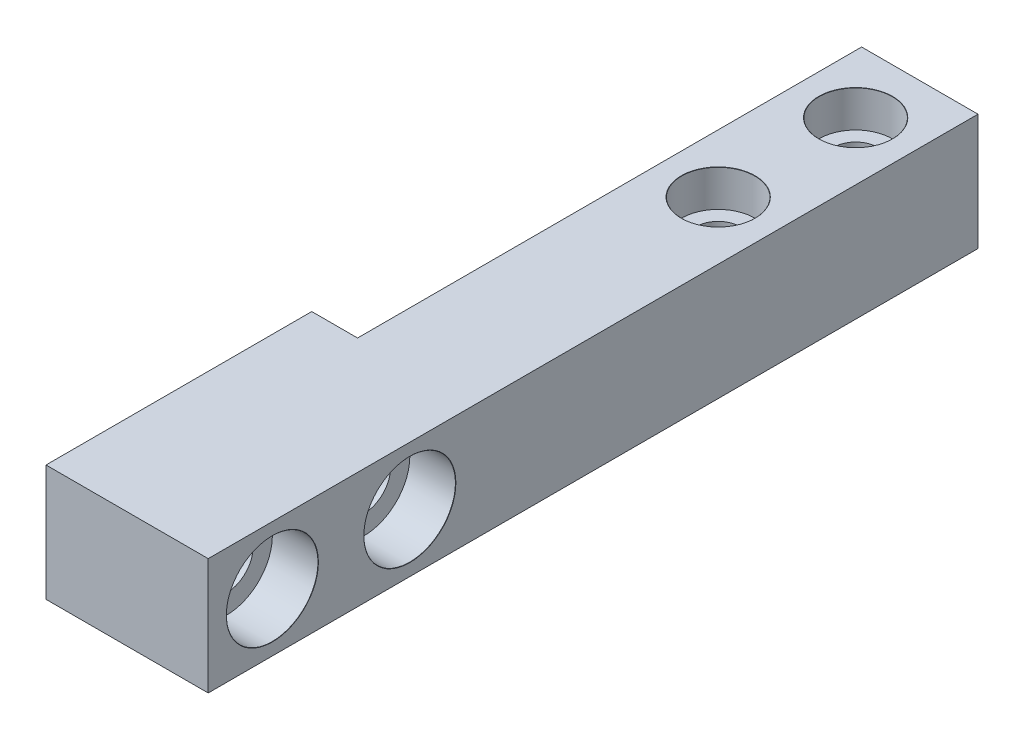
ISO-10303-21;
HEADER;
FILE_DESCRIPTION(('STEP AP214'),'2;1');
FILE_NAME('part.step','',(''),(''),'','','');
FILE_SCHEMA(('AUTOMOTIVE_DESIGN { 1 0 10303 214 1 1 1 1 }'));
ENDSEC;
DATA;
#1=APPLICATION_CONTEXT('core data for automotive mechanical design processes');
#2=APPLICATION_PROTOCOL_DEFINITION('international standard','automotive_design',2000,#1);
#3=PRODUCT_CONTEXT('',#1,'mechanical');
#4=PRODUCT('Part','Part','',(#3));
#5=PRODUCT_RELATED_PRODUCT_CATEGORY('part','',(#4));
#6=PRODUCT_DEFINITION_FORMATION('','',#4);
#7=PRODUCT_DEFINITION_CONTEXT('part definition',#1,'design');
#8=PRODUCT_DEFINITION('design','',#6,#7);
#9=PRODUCT_DEFINITION_SHAPE('','',#8);
#10=(LENGTH_UNIT() NAMED_UNIT(*) SI_UNIT(.MILLI.,.METRE.));
#11=(NAMED_UNIT(*) PLANE_ANGLE_UNIT() SI_UNIT($,.RADIAN.));
#12=(NAMED_UNIT(*) SI_UNIT($,.STERADIAN.) SOLID_ANGLE_UNIT());
#13=UNCERTAINTY_MEASURE_WITH_UNIT(LENGTH_MEASURE(1.E-05),#10,'distance_accuracy_value','');
#14=(GEOMETRIC_REPRESENTATION_CONTEXT(3) GLOBAL_UNCERTAINTY_ASSIGNED_CONTEXT((#13)) GLOBAL_UNIT_ASSIGNED_CONTEXT((#10,
#11,#12)) REPRESENTATION_CONTEXT('',''));
#15=CARTESIAN_POINT('',(0.,0.,0.));
#16=DIRECTION('',(0.,0.,1.));
#17=DIRECTION('',(1.,0.,0.));
#18=AXIS2_PLACEMENT_3D('',#15,#16,#17);
#19=CARTESIAN_POINT('',(-6.35,12.7,42.));
#20=DIRECTION('',(1.,0.,0.));
#21=DIRECTION('',(0.,0.,-1.));
#22=AXIS2_PLACEMENT_3D('',#19,#20,#21);
#23=PLANE('',#22);
#24=DIRECTION('',(0.,-1.,0.));
#25=VECTOR('',#24,1.);
#26=CARTESIAN_POINT('',(-6.35,12.7,13.));
#27=LINE('',#26,#25);
#28=CARTESIAN_POINT('',(-6.35,12.7,13.));
#29=VERTEX_POINT('',#28);
#30=CARTESIAN_POINT('',(-6.35,0.,13.));
#31=VERTEX_POINT('',#30);
#32=EDGE_CURVE('E53',#29,#31,#27,.T.);
#33=ORIENTED_EDGE('',*,*,#32,.F.);
#34=DIRECTION('',(0.,0.,1.));
#35=VECTOR('',#34,1.);
#36=CARTESIAN_POINT('',(-6.35,12.7,42.));
#37=LINE('',#36,#35);
#38=CARTESIAN_POINT('',(-6.35,12.7,-42.));
#39=VERTEX_POINT('',#38);
#40=EDGE_CURVE('E102',#39,#29,#37,.T.);
#41=ORIENTED_EDGE('',*,*,#40,.F.);
#42=DIRECTION('',(0.,-1.,0.));
#43=VECTOR('',#42,1.);
#44=CARTESIAN_POINT('',(-6.35,12.7,-42.));
#45=LINE('',#44,#43);
#46=CARTESIAN_POINT('',(-6.35,0.,-42.));
#47=VERTEX_POINT('',#46);
#48=EDGE_CURVE('E46',#39,#47,#45,.T.);
#49=ORIENTED_EDGE('',*,*,#48,.T.);
#50=DIRECTION('',(0.,0.,1.));
#51=VECTOR('',#50,1.);
#52=CARTESIAN_POINT('',(-6.35,0.,42.));
#53=LINE('',#52,#51);
#54=EDGE_CURVE('E168',#47,#31,#53,.T.);
#55=ORIENTED_EDGE('',*,*,#54,.T.);
#56=EDGE_LOOP('',(#33,#41,#49,#55));
#57=FACE_BOUND('',#56,.T.);
#58=ADVANCED_FACE('F38',(#57),#23,.F.);
#59=CARTESIAN_POINT('',(6.35,12.7,42.));
#60=DIRECTION('',(-1.,0.,0.));
#61=DIRECTION('',(0.,0.,1.));
#62=AXIS2_PLACEMENT_3D('',#59,#60,#61);
#63=PLANE('',#62);
#64=CARTESIAN_POINT('',(6.35,6.35,35.));
#65=DIRECTION('',(1.,0.,0.));
#66=DIRECTION('',(0.,0.,-1.));
#67=AXIS2_PLACEMENT_3D('',#64,#65,#66);
#68=CIRCLE('',#67,5.025);
#69=CARTESIAN_POINT('',(6.35,6.35,29.975));
#70=VERTEX_POINT('',#69);
#71=EDGE_CURVE('E383',#70,#70,#68,.T.);
#72=ORIENTED_EDGE('',*,*,#71,.F.);
#73=EDGE_LOOP('',(#72));
#74=FACE_BOUND('',#73,.T.);
#75=CARTESIAN_POINT('',(6.35,6.35,20.));
#76=DIRECTION('',(1.,0.,0.));
#77=DIRECTION('',(0.,0.,-1.));
#78=AXIS2_PLACEMENT_3D('',#75,#76,#77);
#79=CIRCLE('',#78,5.025);
#80=CARTESIAN_POINT('',(6.35,6.35,14.975));
#81=VERTEX_POINT('',#80);
#82=EDGE_CURVE('E396',#81,#81,#79,.T.);
#83=ORIENTED_EDGE('',*,*,#82,.F.);
#84=EDGE_LOOP('',(#83));
#85=FACE_BOUND('',#84,.T.);
#86=DIRECTION('',(0.,0.,-1.));
#87=VECTOR('',#86,1.);
#88=CARTESIAN_POINT('',(6.35,0.,42.));
#89=LINE('',#88,#87);
#90=CARTESIAN_POINT('',(6.35,0.,42.));
#91=VERTEX_POINT('',#90);
#92=CARTESIAN_POINT('',(6.35,0.,-42.));
#93=VERTEX_POINT('',#92);
#94=EDGE_CURVE('E159',#91,#93,#89,.T.);
#95=ORIENTED_EDGE('',*,*,#94,.T.);
#96=DIRECTION('',(0.,-1.,0.));
#97=VECTOR('',#96,1.);
#98=CARTESIAN_POINT('',(6.35,12.7,-42.));
#99=LINE('',#98,#97);
#100=CARTESIAN_POINT('',(6.35,12.7,-42.));
#101=VERTEX_POINT('',#100);
#102=EDGE_CURVE('E11',#101,#93,#99,.T.);
#103=ORIENTED_EDGE('',*,*,#102,.F.);
#104=DIRECTION('',(0.,0.,-1.));
#105=VECTOR('',#104,1.);
#106=CARTESIAN_POINT('',(6.35,12.7,42.));
#107=LINE('',#106,#105);
#108=CARTESIAN_POINT('',(6.35,12.7,42.));
#109=VERTEX_POINT('',#108);
#110=EDGE_CURVE('E160',#109,#101,#107,.T.);
#111=ORIENTED_EDGE('',*,*,#110,.F.);
#112=DIRECTION('',(0.,-1.,0.));
#113=VECTOR('',#112,1.);
#114=CARTESIAN_POINT('',(6.35,12.7,42.));
#115=LINE('',#114,#113);
#116=EDGE_CURVE('E100',#109,#91,#115,.T.);
#117=ORIENTED_EDGE('',*,*,#116,.T.);
#118=EDGE_LOOP('',(#95,#103,#111,#117));
#119=FACE_BOUND('',#118,.T.);
#120=ADVANCED_FACE('F40',(#74,#85,#119),#63,.F.);
#121=CARTESIAN_POINT('',(-6.35,12.7,-42.));
#122=DIRECTION('',(0.,0.,1.));
#123=DIRECTION('',(1.,0.,0.));
#124=AXIS2_PLACEMENT_3D('',#121,#122,#123);
#125=PLANE('',#124);
#126=DIRECTION('',(-1.,0.,0.));
#127=VECTOR('',#126,1.);
#128=CARTESIAN_POINT('',(-6.35,0.,-42.));
#129=LINE('',#128,#127);
#130=EDGE_CURVE('E166',#93,#47,#129,.T.);
#131=ORIENTED_EDGE('',*,*,#130,.T.);
#132=ORIENTED_EDGE('',*,*,#48,.F.);
#133=DIRECTION('',(-1.,0.,0.));
#134=VECTOR('',#133,1.);
#135=CARTESIAN_POINT('',(-6.35,12.7,-42.));
#136=LINE('',#135,#134);
#137=EDGE_CURVE('E85',#101,#39,#136,.T.);
#138=ORIENTED_EDGE('',*,*,#137,.F.);
#139=ORIENTED_EDGE('',*,*,#102,.T.);
#140=EDGE_LOOP('',(#131,#132,#138,#139));
#141=FACE_BOUND('',#140,.T.);
#142=ADVANCED_FACE('F199',(#141),#125,.F.);
#143=CARTESIAN_POINT('',(-6.35,12.7,42.));
#144=DIRECTION('',(0.,0.,-1.));
#145=DIRECTION('',(-1.,0.,0.));
#146=AXIS2_PLACEMENT_3D('',#143,#144,#145);
#147=PLANE('',#146);
#148=DIRECTION('',(1.,0.,0.));
#149=VECTOR('',#148,1.);
#150=CARTESIAN_POINT('',(-6.35,0.,42.));
#151=LINE('',#150,#149);
#152=CARTESIAN_POINT('',(-11.35,0.,42.));
#153=VERTEX_POINT('',#152);
#154=EDGE_CURVE('E80',#153,#91,#151,.T.);
#155=ORIENTED_EDGE('',*,*,#154,.T.);
#156=ORIENTED_EDGE('',*,*,#116,.F.);
#157=DIRECTION('',(1.,0.,0.));
#158=VECTOR('',#157,1.);
#159=CARTESIAN_POINT('',(-6.35,12.7,42.));
#160=LINE('',#159,#158);
#161=CARTESIAN_POINT('',(-11.35,12.7,42.));
#162=VERTEX_POINT('',#161);
#163=EDGE_CURVE('E62',#162,#109,#160,.T.);
#164=ORIENTED_EDGE('',*,*,#163,.F.);
#165=DIRECTION('',(0.,1.,0.));
#166=VECTOR('',#165,1.);
#167=CARTESIAN_POINT('',(-11.35,12.7,42.));
#168=LINE('',#167,#166);
#169=EDGE_CURVE('E99',#153,#162,#168,.T.);
#170=ORIENTED_EDGE('',*,*,#169,.F.);
#171=EDGE_LOOP('',(#155,#156,#164,#170));
#172=FACE_BOUND('',#171,.T.);
#173=ADVANCED_FACE('F97',(#172),#147,.F.);
#174=CARTESIAN_POINT('',(0.,12.7,0.));
#175=DIRECTION('',(0.,-1.,0.));
#176=DIRECTION('',(0.,0.,-1.));
#177=AXIS2_PLACEMENT_3D('',#174,#175,#176);
#178=PLANE('',#177);
#179=CARTESIAN_POINT('',(0.,12.7,-35.));
#180=DIRECTION('',(0.,1.,0.));
#181=DIRECTION('',(0.,0.,1.));
#182=AXIS2_PLACEMENT_3D('',#179,#180,#181);
#183=CIRCLE('',#182,4.025);
#184=CARTESIAN_POINT('',(0.,12.7,-30.975));
#185=VERTEX_POINT('',#184);
#186=EDGE_CURVE('E129',#185,#185,#183,.T.);
#187=ORIENTED_EDGE('',*,*,#186,.F.);
#188=EDGE_LOOP('',(#187));
#189=FACE_BOUND('',#188,.T.);
#190=CARTESIAN_POINT('',(0.,12.7,-20.));
#191=DIRECTION('',(0.,1.,0.));
#192=DIRECTION('',(0.,0.,1.));
#193=AXIS2_PLACEMENT_3D('',#190,#191,#192);
#194=CIRCLE('',#193,4.025);
#195=CARTESIAN_POINT('',(0.,12.7,-15.975));
#196=VERTEX_POINT('',#195);
#197=EDGE_CURVE('E144',#196,#196,#194,.T.);
#198=ORIENTED_EDGE('',*,*,#197,.F.);
#199=EDGE_LOOP('',(#198));
#200=FACE_BOUND('',#199,.T.);
#201=ORIENTED_EDGE('',*,*,#110,.T.);
#202=ORIENTED_EDGE('',*,*,#137,.T.);
#203=ORIENTED_EDGE('',*,*,#40,.T.);
#204=DIRECTION('',(1.,0.,0.));
#205=VECTOR('',#204,1.);
#206=CARTESIAN_POINT('',(-11.35,12.7,13.));
#207=LINE('',#206,#205);
#208=CARTESIAN_POINT('',(-11.35,12.7,13.));
#209=VERTEX_POINT('',#208);
#210=EDGE_CURVE('E108',#209,#29,#207,.T.);
#211=ORIENTED_EDGE('',*,*,#210,.F.);
#212=DIRECTION('',(0.,0.,-1.));
#213=VECTOR('',#212,1.);
#214=CARTESIAN_POINT('',(-11.35,12.7,42.));
#215=LINE('',#214,#213);
#216=EDGE_CURVE('E105',#162,#209,#215,.T.);
#217=ORIENTED_EDGE('',*,*,#216,.F.);
#218=ORIENTED_EDGE('',*,*,#163,.T.);
#219=EDGE_LOOP('',(#201,#202,#203,#211,#217,#218));
#220=FACE_BOUND('',#219,.T.);
#221=ADVANCED_FACE('F106',(#189,#200,#220),#178,.F.);
#222=CARTESIAN_POINT('',(0.,0.,0.));
#223=DIRECTION('',(0.,-1.,0.));
#224=DIRECTION('',(0.,0.,-1.));
#225=AXIS2_PLACEMENT_3D('',#222,#223,#224);
#226=PLANE('',#225);
#227=CARTESIAN_POINT('',(0.,0.,-35.));
#228=DIRECTION('',(0.,1.,0.));
#229=DIRECTION('',(0.,0.,1.));
#230=AXIS2_PLACEMENT_3D('',#227,#228,#229);
#231=CIRCLE('',#230,2.4);
#232=CARTESIAN_POINT('',(0.,0.,-32.6));
#233=VERTEX_POINT('',#232);
#234=EDGE_CURVE('E141',#233,#233,#231,.T.);
#235=ORIENTED_EDGE('',*,*,#234,.T.);
#236=EDGE_LOOP('',(#235));
#237=FACE_BOUND('',#236,.T.);
#238=CARTESIAN_POINT('',(0.,0.,-20.));
#239=DIRECTION('',(0.,1.,0.));
#240=DIRECTION('',(0.,0.,1.));
#241=AXIS2_PLACEMENT_3D('',#238,#239,#240);
#242=CIRCLE('',#241,2.4);
#243=CARTESIAN_POINT('',(0.,0.,-17.6));
#244=VERTEX_POINT('',#243);
#245=EDGE_CURVE('E156',#244,#244,#242,.T.);
#246=ORIENTED_EDGE('',*,*,#245,.T.);
#247=EDGE_LOOP('',(#246));
#248=FACE_BOUND('',#247,.T.);
#249=ORIENTED_EDGE('',*,*,#94,.F.);
#250=ORIENTED_EDGE('',*,*,#154,.F.);
#251=DIRECTION('',(0.,0.,1.));
#252=VECTOR('',#251,1.);
#253=CARTESIAN_POINT('',(-11.35,0.,42.));
#254=LINE('',#253,#252);
#255=CARTESIAN_POINT('',(-11.35,0.,13.));
#256=VERTEX_POINT('',#255);
#257=EDGE_CURVE('E116',#256,#153,#254,.T.);
#258=ORIENTED_EDGE('',*,*,#257,.F.);
#259=DIRECTION('',(1.,0.,0.));
#260=VECTOR('',#259,1.);
#261=CARTESIAN_POINT('',(-11.35,0.,13.));
#262=LINE('',#261,#260);
#263=EDGE_CURVE('E124',#256,#31,#262,.T.);
#264=ORIENTED_EDGE('',*,*,#263,.T.);
#265=ORIENTED_EDGE('',*,*,#54,.F.);
#266=ORIENTED_EDGE('',*,*,#130,.F.);
#267=EDGE_LOOP('',(#249,#250,#258,#264,#265,#266));
#268=FACE_BOUND('',#267,.T.);
#269=ADVANCED_FACE('F175',(#237,#248,#268),#226,.T.);
#270=CARTESIAN_POINT('',(0.,12.7,-20.));
#271=DIRECTION('',(0.,1.,0.));
#272=DIRECTION('',(0.,0.,1.));
#273=AXIS2_PLACEMENT_3D('',#270,#271,#272);
#274=CYLINDRICAL_SURFACE('',#273,2.4);
#275=ORIENTED_EDGE('',*,*,#245,.F.);
#276=EDGE_LOOP('',(#275));
#277=FACE_BOUND('',#276,.T.);
#278=CARTESIAN_POINT('',(0.,8.7,-20.));
#279=DIRECTION('',(0.,1.,0.));
#280=DIRECTION('',(0.,0.,1.));
#281=AXIS2_PLACEMENT_3D('',#278,#279,#280);
#282=CIRCLE('',#281,2.4);
#283=CARTESIAN_POINT('',(0.,8.7,-17.6));
#284=VERTEX_POINT('',#283);
#285=EDGE_CURVE('E153',#284,#284,#282,.T.);
#286=ORIENTED_EDGE('',*,*,#285,.T.);
#287=EDGE_LOOP('',(#286));
#288=FACE_BOUND('',#287,.T.);
#289=ADVANCED_FACE('F216',(#277,#288),#274,.F.);
#290=CARTESIAN_POINT('',(4.,8.7,-20.));
#291=DIRECTION('',(0.,-1.,0.));
#292=DIRECTION('',(0.,0.,-1.));
#293=AXIS2_PLACEMENT_3D('',#290,#291,#292);
#294=PLANE('',#293);
#295=ORIENTED_EDGE('',*,*,#285,.F.);
#296=EDGE_LOOP('',(#295));
#297=FACE_BOUND('',#296,.T.);
#298=CARTESIAN_POINT('',(0.,8.7,-20.));
#299=DIRECTION('',(0.,1.,0.));
#300=DIRECTION('',(0.,0.,1.));
#301=AXIS2_PLACEMENT_3D('',#298,#299,#300);
#302=CIRCLE('',#301,4.);
#303=CARTESIAN_POINT('',(0.,8.7,-16.));
#304=VERTEX_POINT('',#303);
#305=EDGE_CURVE('E150',#304,#304,#302,.T.);
#306=ORIENTED_EDGE('',*,*,#305,.T.);
#307=EDGE_LOOP('',(#306));
#308=FACE_BOUND('',#307,.T.);
#309=ADVANCED_FACE('F222',(#297,#308),#294,.F.);
#310=CARTESIAN_POINT('',(0.,12.7,-20.));
#311=DIRECTION('',(0.,1.,0.));
#312=DIRECTION('',(0.,0.,1.));
#313=AXIS2_PLACEMENT_3D('',#310,#311,#312);
#314=CYLINDRICAL_SURFACE('',#313,4.);
#315=ORIENTED_EDGE('',*,*,#305,.F.);
#316=EDGE_LOOP('',(#315));
#317=FACE_BOUND('',#316,.T.);
#318=CARTESIAN_POINT('',(0.,12.6790225092206,-20.));
#319=DIRECTION('',(0.,1.,0.));
#320=DIRECTION('',(0.,0.,1.));
#321=AXIS2_PLACEMENT_3D('',#318,#319,#320);
#322=CIRCLE('',#321,4.);
#323=CARTESIAN_POINT('',(0.,12.6790225092206,-16.));
#324=VERTEX_POINT('',#323);
#325=EDGE_CURVE('E147',#324,#324,#322,.T.);
#326=ORIENTED_EDGE('',*,*,#325,.T.);
#327=EDGE_LOOP('',(#326));
#328=FACE_BOUND('',#327,.T.);
#329=ADVANCED_FACE('F226',(#317,#328),#314,.F.);
#330=CARTESIAN_POINT('',(0.,12.7,-20.));
#331=DIRECTION('',(0.,1.,0.));
#332=DIRECTION('',(0.,0.,1.));
#333=AXIS2_PLACEMENT_3D('',#330,#331,#332);
#334=CONICAL_SURFACE('',#333,4.025,0.872664625997152);
#335=ORIENTED_EDGE('',*,*,#325,.F.);
#336=EDGE_LOOP('',(#335));
#337=FACE_BOUND('',#336,.T.);
#338=ORIENTED_EDGE('',*,*,#197,.T.);
#339=EDGE_LOOP('',(#338));
#340=FACE_BOUND('',#339,.T.);
#341=ADVANCED_FACE('F230',(#337,#340),#334,.F.);
#342=CARTESIAN_POINT('',(0.,12.7,-35.));
#343=DIRECTION('',(0.,1.,0.));
#344=DIRECTION('',(0.,0.,1.));
#345=AXIS2_PLACEMENT_3D('',#342,#343,#344);
#346=CYLINDRICAL_SURFACE('',#345,2.4);
#347=ORIENTED_EDGE('',*,*,#234,.F.);
#348=EDGE_LOOP('',(#347));
#349=FACE_BOUND('',#348,.T.);
#350=CARTESIAN_POINT('',(0.,8.7,-35.));
#351=DIRECTION('',(0.,1.,0.));
#352=DIRECTION('',(0.,0.,1.));
#353=AXIS2_PLACEMENT_3D('',#350,#351,#352);
#354=CIRCLE('',#353,2.4);
#355=CARTESIAN_POINT('',(0.,8.7,-32.6));
#356=VERTEX_POINT('',#355);
#357=EDGE_CURVE('E138',#356,#356,#354,.T.);
#358=ORIENTED_EDGE('',*,*,#357,.T.);
#359=EDGE_LOOP('',(#358));
#360=FACE_BOUND('',#359,.T.);
#361=ADVANCED_FACE('F234',(#349,#360),#346,.F.);
#362=CARTESIAN_POINT('',(4.,8.7,-35.));
#363=DIRECTION('',(0.,-1.,0.));
#364=DIRECTION('',(0.,0.,-1.));
#365=AXIS2_PLACEMENT_3D('',#362,#363,#364);
#366=PLANE('',#365);
#367=ORIENTED_EDGE('',*,*,#357,.F.);
#368=EDGE_LOOP('',(#367));
#369=FACE_BOUND('',#368,.T.);
#370=CARTESIAN_POINT('',(0.,8.7,-35.));
#371=DIRECTION('',(0.,1.,0.));
#372=DIRECTION('',(0.,0.,1.));
#373=AXIS2_PLACEMENT_3D('',#370,#371,#372);
#374=CIRCLE('',#373,4.);
#375=CARTESIAN_POINT('',(0.,8.7,-31.));
#376=VERTEX_POINT('',#375);
#377=EDGE_CURVE('E135',#376,#376,#374,.T.);
#378=ORIENTED_EDGE('',*,*,#377,.T.);
#379=EDGE_LOOP('',(#378));
#380=FACE_BOUND('',#379,.T.);
#381=ADVANCED_FACE('F238',(#369,#380),#366,.F.);
#382=CARTESIAN_POINT('',(0.,12.7,-35.));
#383=DIRECTION('',(0.,1.,0.));
#384=DIRECTION('',(0.,0.,1.));
#385=AXIS2_PLACEMENT_3D('',#382,#383,#384);
#386=CYLINDRICAL_SURFACE('',#385,4.);
#387=ORIENTED_EDGE('',*,*,#377,.F.);
#388=EDGE_LOOP('',(#387));
#389=FACE_BOUND('',#388,.T.);
#390=CARTESIAN_POINT('',(0.,12.6790225092206,-35.));
#391=DIRECTION('',(0.,1.,0.));
#392=DIRECTION('',(0.,0.,1.));
#393=AXIS2_PLACEMENT_3D('',#390,#391,#392);
#394=CIRCLE('',#393,4.);
#395=CARTESIAN_POINT('',(0.,12.6790225092206,-31.));
#396=VERTEX_POINT('',#395);
#397=EDGE_CURVE('E132',#396,#396,#394,.T.);
#398=ORIENTED_EDGE('',*,*,#397,.T.);
#399=EDGE_LOOP('',(#398));
#400=FACE_BOUND('',#399,.T.);
#401=ADVANCED_FACE('F191',(#389,#400),#386,.F.);
#402=CARTESIAN_POINT('',(0.,12.7,-35.));
#403=DIRECTION('',(0.,1.,0.));
#404=DIRECTION('',(0.,0.,1.));
#405=AXIS2_PLACEMENT_3D('',#402,#403,#404);
#406=CONICAL_SURFACE('',#405,4.025,0.872664625997152);
#407=ORIENTED_EDGE('',*,*,#397,.F.);
#408=EDGE_LOOP('',(#407));
#409=FACE_BOUND('',#408,.T.);
#410=ORIENTED_EDGE('',*,*,#186,.T.);
#411=EDGE_LOOP('',(#410));
#412=FACE_BOUND('',#411,.T.);
#413=ADVANCED_FACE('F180',(#409,#412),#406,.F.);
#414=CARTESIAN_POINT('',(-11.35,12.7,13.));
#415=DIRECTION('',(0.,0.,1.));
#416=DIRECTION('',(0.,-1.,0.));
#417=AXIS2_PLACEMENT_3D('',#414,#415,#416);
#418=PLANE('',#417);
#419=ORIENTED_EDGE('',*,*,#32,.T.);
#420=ORIENTED_EDGE('',*,*,#263,.F.);
#421=DIRECTION('',(0.,-1.,0.));
#422=VECTOR('',#421,1.);
#423=CARTESIAN_POINT('',(-11.35,12.7,13.));
#424=LINE('',#423,#422);
#425=EDGE_CURVE('E111',#209,#256,#424,.T.);
#426=ORIENTED_EDGE('',*,*,#425,.F.);
#427=ORIENTED_EDGE('',*,*,#210,.T.);
#428=EDGE_LOOP('',(#419,#420,#426,#427));
#429=FACE_BOUND('',#428,.T.);
#430=ADVANCED_FACE('F178',(#429),#418,.F.);
#431=CARTESIAN_POINT('',(-11.35,0.,0.));
#432=DIRECTION('',(1.,0.,0.));
#433=DIRECTION('',(0.,0.,-1.));
#434=AXIS2_PLACEMENT_3D('',#431,#432,#433);
#435=PLANE('',#434);
#436=CARTESIAN_POINT('',(-11.35,6.35,35.));
#437=DIRECTION('',(1.,0.,0.));
#438=DIRECTION('',(0.,0.,-1.));
#439=AXIS2_PLACEMENT_3D('',#436,#437,#438);
#440=CIRCLE('',#439,2.89999999999999);
#441=CARTESIAN_POINT('',(-11.35,6.35,32.1));
#442=VERTEX_POINT('',#441);
#443=EDGE_CURVE('E393',#442,#442,#440,.T.);
#444=ORIENTED_EDGE('',*,*,#443,.T.);
#445=EDGE_LOOP('',(#444));
#446=FACE_BOUND('',#445,.T.);
#447=CARTESIAN_POINT('',(-11.35,6.35,20.));
#448=DIRECTION('',(1.,0.,0.));
#449=DIRECTION('',(0.,0.,-1.));
#450=AXIS2_PLACEMENT_3D('',#447,#448,#449);
#451=CIRCLE('',#450,2.89999999999999);
#452=CARTESIAN_POINT('',(-11.35,6.35,17.1));
#453=VERTEX_POINT('',#452);
#454=EDGE_CURVE('E118',#453,#453,#451,.T.);
#455=ORIENTED_EDGE('',*,*,#454,.T.);
#456=EDGE_LOOP('',(#455));
#457=FACE_BOUND('',#456,.T.);
#458=ORIENTED_EDGE('',*,*,#169,.T.);
#459=ORIENTED_EDGE('',*,*,#216,.T.);
#460=ORIENTED_EDGE('',*,*,#425,.T.);
#461=ORIENTED_EDGE('',*,*,#257,.T.);
#462=EDGE_LOOP('',(#458,#459,#460,#461));
#463=FACE_BOUND('',#462,.T.);
#464=ADVANCED_FACE('F114',(#446,#457,#463),#435,.F.);
#465=CARTESIAN_POINT('',(6.35,6.35,20.));
#466=DIRECTION('',(1.,0.,0.));
#467=DIRECTION('',(0.,0.,-1.));
#468=AXIS2_PLACEMENT_3D('',#465,#466,#467);
#469=CYLINDRICAL_SURFACE('',#468,2.9);
#470=ORIENTED_EDGE('',*,*,#454,.F.);
#471=EDGE_LOOP('',(#470));
#472=FACE_BOUND('',#471,.T.);
#473=CARTESIAN_POINT('',(1.35,6.35,20.));
#474=DIRECTION('',(1.,0.,0.));
#475=DIRECTION('',(0.,0.,-1.));
#476=AXIS2_PLACEMENT_3D('',#473,#474,#475);
#477=CIRCLE('',#476,2.9);
#478=CARTESIAN_POINT('',(1.35,6.35,17.1));
#479=VERTEX_POINT('',#478);
#480=EDGE_CURVE('E404',#479,#479,#477,.T.);
#481=ORIENTED_EDGE('',*,*,#480,.T.);
#482=EDGE_LOOP('',(#481));
#483=FACE_BOUND('',#482,.T.);
#484=ADVANCED_FACE('F187',(#472,#483),#469,.F.);
#485=CARTESIAN_POINT('',(1.35,11.35,20.));
#486=DIRECTION('',(-1.,0.,0.));
#487=DIRECTION('',(0.,0.,1.));
#488=AXIS2_PLACEMENT_3D('',#485,#486,#487);
#489=PLANE('',#488);
#490=ORIENTED_EDGE('',*,*,#480,.F.);
#491=EDGE_LOOP('',(#490));
#492=FACE_BOUND('',#491,.T.);
#493=CARTESIAN_POINT('',(1.35,6.35,20.));
#494=DIRECTION('',(1.,0.,0.));
#495=DIRECTION('',(0.,0.,-1.));
#496=AXIS2_PLACEMENT_3D('',#493,#494,#495);
#497=CIRCLE('',#496,5.);
#498=CARTESIAN_POINT('',(1.35,6.35,15.));
#499=VERTEX_POINT('',#498);
#500=EDGE_CURVE('E402',#499,#499,#497,.T.);
#501=ORIENTED_EDGE('',*,*,#500,.T.);
#502=EDGE_LOOP('',(#501));
#503=FACE_BOUND('',#502,.T.);
#504=ADVANCED_FACE('F304',(#492,#503),#489,.F.);
#505=CARTESIAN_POINT('',(6.35,6.35,20.));
#506=DIRECTION('',(1.,0.,0.));
#507=DIRECTION('',(0.,0.,-1.));
#508=AXIS2_PLACEMENT_3D('',#505,#506,#507);
#509=CYLINDRICAL_SURFACE('',#508,5.);
#510=ORIENTED_EDGE('',*,*,#500,.F.);
#511=EDGE_LOOP('',(#510));
#512=FACE_BOUND('',#511,.T.);
#513=CARTESIAN_POINT('',(6.32902250922057,6.35,20.));
#514=DIRECTION('',(1.,0.,0.));
#515=DIRECTION('',(0.,0.,-1.));
#516=AXIS2_PLACEMENT_3D('',#513,#514,#515);
#517=CIRCLE('',#516,5.);
#518=CARTESIAN_POINT('',(6.32902250922057,6.35,15.));
#519=VERTEX_POINT('',#518);
#520=EDGE_CURVE('E399',#519,#519,#517,.T.);
#521=ORIENTED_EDGE('',*,*,#520,.T.);
#522=EDGE_LOOP('',(#521));
#523=FACE_BOUND('',#522,.T.);
#524=ADVANCED_FACE('F314',(#512,#523),#509,.F.);
#525=CARTESIAN_POINT('',(6.35,6.35,20.));
#526=DIRECTION('',(1.,0.,0.));
#527=DIRECTION('',(0.,0.,-1.));
#528=AXIS2_PLACEMENT_3D('',#525,#526,#527);
#529=CONICAL_SURFACE('',#528,5.025,0.872664625997138);
#530=ORIENTED_EDGE('',*,*,#520,.F.);
#531=EDGE_LOOP('',(#530));
#532=FACE_BOUND('',#531,.T.);
#533=ORIENTED_EDGE('',*,*,#82,.T.);
#534=EDGE_LOOP('',(#533));
#535=FACE_BOUND('',#534,.T.);
#536=ADVANCED_FACE('F324',(#532,#535),#529,.F.);
#537=CARTESIAN_POINT('',(6.35,6.35,35.));
#538=DIRECTION('',(1.,0.,0.));
#539=DIRECTION('',(0.,0.,-1.));
#540=AXIS2_PLACEMENT_3D('',#537,#538,#539);
#541=CYLINDRICAL_SURFACE('',#540,2.9);
#542=ORIENTED_EDGE('',*,*,#443,.F.);
#543=EDGE_LOOP('',(#542));
#544=FACE_BOUND('',#543,.T.);
#545=CARTESIAN_POINT('',(1.35,6.35,35.));
#546=DIRECTION('',(1.,0.,0.));
#547=DIRECTION('',(0.,0.,-1.));
#548=AXIS2_PLACEMENT_3D('',#545,#546,#547);
#549=CIRCLE('',#548,2.9);
#550=CARTESIAN_POINT('',(1.35,6.35,32.1));
#551=VERTEX_POINT('',#550);
#552=EDGE_CURVE('E390',#551,#551,#549,.T.);
#553=ORIENTED_EDGE('',*,*,#552,.T.);
#554=EDGE_LOOP('',(#553));
#555=FACE_BOUND('',#554,.T.);
#556=ADVANCED_FACE('F334',(#544,#555),#541,.F.);
#557=CARTESIAN_POINT('',(1.35,11.35,35.));
#558=DIRECTION('',(-1.,0.,0.));
#559=DIRECTION('',(0.,0.,1.));
#560=AXIS2_PLACEMENT_3D('',#557,#558,#559);
#561=PLANE('',#560);
#562=ORIENTED_EDGE('',*,*,#552,.F.);
#563=EDGE_LOOP('',(#562));
#564=FACE_BOUND('',#563,.T.);
#565=CARTESIAN_POINT('',(1.35,6.35,35.));
#566=DIRECTION('',(1.,0.,0.));
#567=DIRECTION('',(0.,0.,-1.));
#568=AXIS2_PLACEMENT_3D('',#565,#566,#567);
#569=CIRCLE('',#568,5.);
#570=CARTESIAN_POINT('',(1.35,6.35,30.));
#571=VERTEX_POINT('',#570);
#572=EDGE_CURVE('E385',#571,#571,#569,.T.);
#573=ORIENTED_EDGE('',*,*,#572,.T.);
#574=EDGE_LOOP('',(#573));
#575=FACE_BOUND('',#574,.T.);
#576=ADVANCED_FACE('F344',(#564,#575),#561,.F.);
#577=CARTESIAN_POINT('',(6.35,6.35,35.));
#578=DIRECTION('',(1.,0.,0.));
#579=DIRECTION('',(0.,0.,-1.));
#580=AXIS2_PLACEMENT_3D('',#577,#578,#579);
#581=CYLINDRICAL_SURFACE('',#580,5.);
#582=ORIENTED_EDGE('',*,*,#572,.F.);
#583=EDGE_LOOP('',(#582));
#584=FACE_BOUND('',#583,.T.);
#585=CARTESIAN_POINT('',(6.32902250922057,6.35,35.));
#586=DIRECTION('',(1.,0.,0.));
#587=DIRECTION('',(0.,0.,-1.));
#588=AXIS2_PLACEMENT_3D('',#585,#586,#587);
#589=CIRCLE('',#588,5.);
#590=CARTESIAN_POINT('',(6.32902250922057,6.35,30.));
#591=VERTEX_POINT('',#590);
#592=EDGE_CURVE('E380',#591,#591,#589,.T.);
#593=ORIENTED_EDGE('',*,*,#592,.T.);
#594=EDGE_LOOP('',(#593));
#595=FACE_BOUND('',#594,.T.);
#596=ADVANCED_FACE('F354',(#584,#595),#581,.F.);
#597=CARTESIAN_POINT('',(6.35,6.35,35.));
#598=DIRECTION('',(1.,0.,0.));
#599=DIRECTION('',(0.,0.,-1.));
#600=AXIS2_PLACEMENT_3D('',#597,#598,#599);
#601=CONICAL_SURFACE('',#600,5.025,0.872664625997138);
#602=ORIENTED_EDGE('',*,*,#592,.F.);
#603=EDGE_LOOP('',(#602));
#604=FACE_BOUND('',#603,.T.);
#605=ORIENTED_EDGE('',*,*,#71,.T.);
#606=EDGE_LOOP('',(#605));
#607=FACE_BOUND('',#606,.T.);
#608=ADVANCED_FACE('F364',(#604,#607),#601,.F.);
#609=CLOSED_SHELL('',(#58,#120,#142,#173,#221,#269,#289,#309,#329,#341,#361,#381,#401,#413,#430,
#464,#484,#504,#524,#536,#556,#576,#596,#608));
#610=MANIFOLD_SOLID_BREP('B2',#609);
#611=ADVANCED_BREP_SHAPE_REPRESENTATION('',(#18,#610),#14);
#612=SHAPE_DEFINITION_REPRESENTATION(#9,#611);
ENDSEC;
END-ISO-10303-21;
